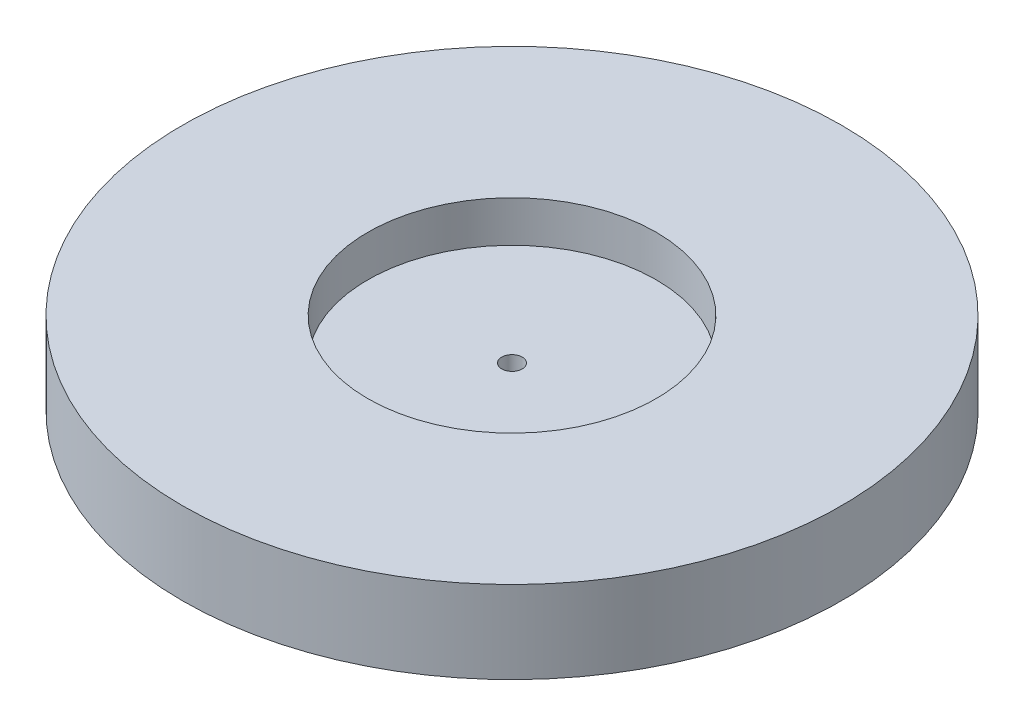
ISO-10303-21;
HEADER;
FILE_DESCRIPTION(('STEP AP214'),'2;1');
FILE_NAME('part.step','',(''),(''),'','','');
FILE_SCHEMA(('AUTOMOTIVE_DESIGN { 1 0 10303 214 1 1 1 1 }'));
ENDSEC;
DATA;
#1=APPLICATION_CONTEXT('core data for automotive mechanical design processes');
#2=APPLICATION_PROTOCOL_DEFINITION('international standard','automotive_design',2000,#1);
#3=PRODUCT_CONTEXT('',#1,'mechanical');
#4=PRODUCT('Part','Part','',(#3));
#5=PRODUCT_RELATED_PRODUCT_CATEGORY('part','',(#4));
#6=PRODUCT_DEFINITION_FORMATION('','',#4);
#7=PRODUCT_DEFINITION_CONTEXT('part definition',#1,'design');
#8=PRODUCT_DEFINITION('design','',#6,#7);
#9=PRODUCT_DEFINITION_SHAPE('','',#8);
#10=(LENGTH_UNIT() NAMED_UNIT(*) SI_UNIT(.MILLI.,.METRE.));
#11=(NAMED_UNIT(*) PLANE_ANGLE_UNIT() SI_UNIT($,.RADIAN.));
#12=(NAMED_UNIT(*) SI_UNIT($,.STERADIAN.) SOLID_ANGLE_UNIT());
#13=UNCERTAINTY_MEASURE_WITH_UNIT(LENGTH_MEASURE(1.E-05),#10,'distance_accuracy_value','');
#14=(GEOMETRIC_REPRESENTATION_CONTEXT(3) GLOBAL_UNCERTAINTY_ASSIGNED_CONTEXT((#13)) GLOBAL_UNIT_ASSIGNED_CONTEXT((#10,
#11,#12)) REPRESENTATION_CONTEXT('',''));
#15=CARTESIAN_POINT('',(0.,0.,0.));
#16=DIRECTION('',(0.,0.,1.));
#17=DIRECTION('',(1.,0.,0.));
#18=AXIS2_PLACEMENT_3D('',#15,#16,#17);
#19=CARTESIAN_POINT('',(0.,25.4,0.));
#20=DIRECTION('',(0.,-1.,0.));
#21=DIRECTION('',(0.,0.,-1.));
#22=AXIS2_PLACEMENT_3D('',#19,#20,#21);
#23=CYLINDRICAL_SURFACE('',#22,3.175);
#24=CARTESIAN_POINT('',(0.,0.,0.));
#25=DIRECTION('',(0.,1.,0.));
#26=DIRECTION('',(0.,0.,1.));
#27=AXIS2_PLACEMENT_3D('',#24,#25,#26);
#28=CIRCLE('',#27,3.175);
#29=CARTESIAN_POINT('',(0.,0.,3.175));
#30=VERTEX_POINT('',#29);
#31=EDGE_CURVE('E46',#30,#30,#28,.T.);
#32=ORIENTED_EDGE('',*,*,#31,.F.);
#33=EDGE_LOOP('',(#32));
#34=FACE_BOUND('',#33,.T.);
#35=CARTESIAN_POINT('',(0.,12.7,0.));
#36=DIRECTION('',(0.,1.,0.));
#37=DIRECTION('',(0.,0.,1.));
#38=AXIS2_PLACEMENT_3D('',#35,#36,#37);
#39=CIRCLE('',#38,3.175);
#40=CARTESIAN_POINT('',(0.,12.7,3.175));
#41=VERTEX_POINT('',#40);
#42=EDGE_CURVE('E37',#41,#41,#39,.T.);
#43=ORIENTED_EDGE('',*,*,#42,.T.);
#44=EDGE_LOOP('',(#43));
#45=FACE_BOUND('',#44,.T.);
#46=ADVANCED_FACE('F33',(#34,#45),#23,.F.);
#47=CARTESIAN_POINT('',(0.,25.4,0.));
#48=DIRECTION('',(0.,1.,0.));
#49=DIRECTION('',(0.,0.,1.));
#50=AXIS2_PLACEMENT_3D('',#47,#48,#49);
#51=PLANE('',#50);
#52=CARTESIAN_POINT('',(0.,25.4,0.));
#53=DIRECTION('',(0.,1.,0.));
#54=DIRECTION('',(0.,0.,1.));
#55=AXIS2_PLACEMENT_3D('',#52,#53,#54);
#56=CIRCLE('',#55,44.45);
#57=CARTESIAN_POINT('',(0.,25.4,44.45));
#58=VERTEX_POINT('',#57);
#59=EDGE_CURVE('E50',#58,#58,#56,.T.);
#60=ORIENTED_EDGE('',*,*,#59,.F.);
#61=EDGE_LOOP('',(#60));
#62=FACE_BOUND('',#61,.T.);
#63=CARTESIAN_POINT('',(0.,25.4,0.));
#64=DIRECTION('',(0.,1.,0.));
#65=DIRECTION('',(0.,0.,1.));
#66=AXIS2_PLACEMENT_3D('',#63,#64,#65);
#67=CIRCLE('',#66,101.6);
#68=CARTESIAN_POINT('',(0.,25.4,101.6));
#69=VERTEX_POINT('',#68);
#70=EDGE_CURVE('E10',#69,#69,#67,.T.);
#71=ORIENTED_EDGE('',*,*,#70,.T.);
#72=EDGE_LOOP('',(#71));
#73=FACE_BOUND('',#72,.T.);
#74=ADVANCED_FACE('F71',(#62,#73),#51,.T.);
#75=CARTESIAN_POINT('',(0.,0.,0.));
#76=DIRECTION('',(0.,1.,0.));
#77=DIRECTION('',(0.,0.,1.));
#78=AXIS2_PLACEMENT_3D('',#75,#76,#77);
#79=PLANE('',#78);
#80=CARTESIAN_POINT('',(0.,0.,0.));
#81=DIRECTION('',(0.,1.,0.));
#82=DIRECTION('',(0.,0.,1.));
#83=AXIS2_PLACEMENT_3D('',#80,#81,#82);
#84=CIRCLE('',#83,101.6);
#85=CARTESIAN_POINT('',(0.,0.,101.6));
#86=VERTEX_POINT('',#85);
#87=EDGE_CURVE('E41',#86,#86,#84,.T.);
#88=ORIENTED_EDGE('',*,*,#87,.F.);
#89=EDGE_LOOP('',(#88));
#90=FACE_BOUND('',#89,.T.);
#91=ORIENTED_EDGE('',*,*,#31,.T.);
#92=EDGE_LOOP('',(#91));
#93=FACE_BOUND('',#92,.T.);
#94=ADVANCED_FACE('F77',(#90,#93),#79,.F.);
#95=CARTESIAN_POINT('',(0.,25.4,0.));
#96=DIRECTION('',(0.,-1.,0.));
#97=DIRECTION('',(0.,0.,-1.));
#98=AXIS2_PLACEMENT_3D('',#95,#96,#97);
#99=CYLINDRICAL_SURFACE('',#98,101.6);
#100=ORIENTED_EDGE('',*,*,#70,.F.);
#101=EDGE_LOOP('',(#100));
#102=FACE_BOUND('',#101,.T.);
#103=ORIENTED_EDGE('',*,*,#87,.T.);
#104=EDGE_LOOP('',(#103));
#105=FACE_BOUND('',#104,.T.);
#106=ADVANCED_FACE('F35',(#102,#105),#99,.T.);
#107=CARTESIAN_POINT('',(0.,12.7,0.));
#108=DIRECTION('',(0.,1.,0.));
#109=DIRECTION('',(0.,0.,1.));
#110=AXIS2_PLACEMENT_3D('',#107,#108,#109);
#111=CYLINDRICAL_SURFACE('',#110,44.45);
#112=CARTESIAN_POINT('',(0.,12.7,0.));
#113=DIRECTION('',(0.,1.,0.));
#114=DIRECTION('',(0.,0.,1.));
#115=AXIS2_PLACEMENT_3D('',#112,#113,#114);
#116=CIRCLE('',#115,44.45);
#117=CARTESIAN_POINT('',(0.,12.7,44.45));
#118=VERTEX_POINT('',#117);
#119=EDGE_CURVE('E53',#118,#118,#116,.T.);
#120=ORIENTED_EDGE('',*,*,#119,.F.);
#121=EDGE_LOOP('',(#120));
#122=FACE_BOUND('',#121,.T.);
#123=ORIENTED_EDGE('',*,*,#59,.T.);
#124=EDGE_LOOP('',(#123));
#125=FACE_BOUND('',#124,.T.);
#126=ADVANCED_FACE('F63',(#122,#125),#111,.F.);
#127=CARTESIAN_POINT('',(0.,12.7,0.));
#128=DIRECTION('',(0.,1.,0.));
#129=DIRECTION('',(0.,0.,1.));
#130=AXIS2_PLACEMENT_3D('',#127,#128,#129);
#131=PLANE('',#130);
#132=ORIENTED_EDGE('',*,*,#42,.F.);
#133=EDGE_LOOP('',(#132));
#134=FACE_BOUND('',#133,.T.);
#135=ORIENTED_EDGE('',*,*,#119,.T.);
#136=EDGE_LOOP('',(#135));
#137=FACE_BOUND('',#136,.T.);
#138=ADVANCED_FACE('F61',(#134,#137),#131,.T.);
#139=CLOSED_SHELL('',(#46,#74,#94,#106,#126,#138));
#140=MANIFOLD_SOLID_BREP('B2',#139);
#141=ADVANCED_BREP_SHAPE_REPRESENTATION('',(#18,#140),#14);
#142=SHAPE_DEFINITION_REPRESENTATION(#9,#141);
ENDSEC;
END-ISO-10303-21;
